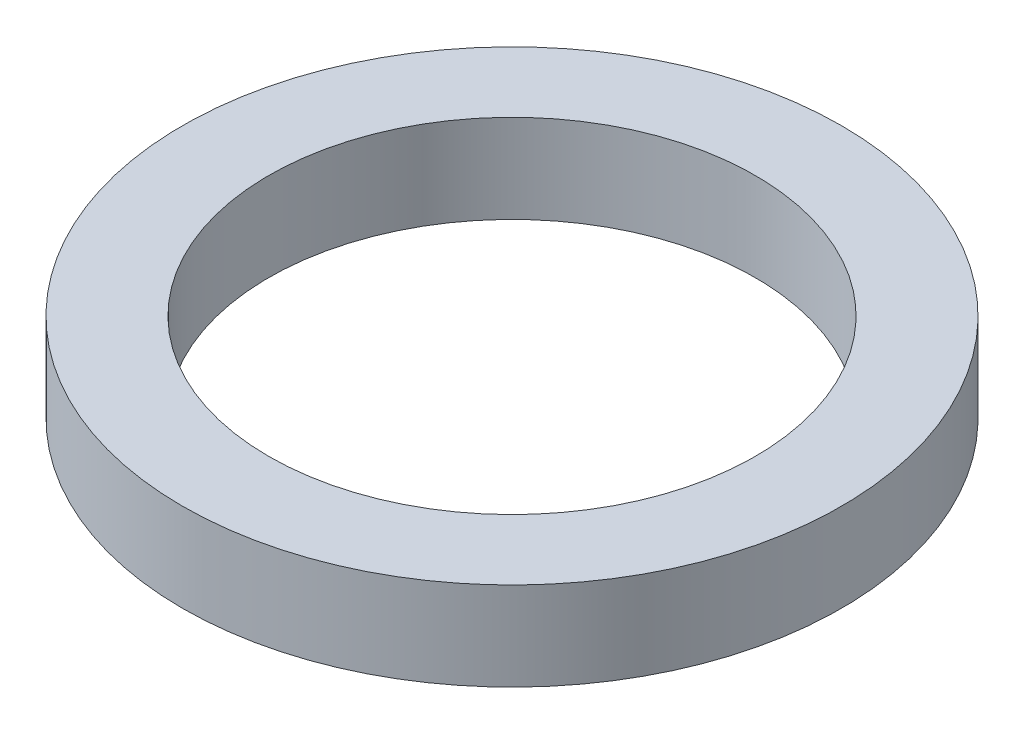
ISO-10303-21;
HEADER;
FILE_DESCRIPTION(('STEP AP214'),'2;1');
FILE_NAME('part.step','',(''),(''),'','','');
FILE_SCHEMA(('AUTOMOTIVE_DESIGN { 1 0 10303 214 1 1 1 1 }'));
ENDSEC;
DATA;
#1=APPLICATION_CONTEXT('core data for automotive mechanical design processes');
#2=APPLICATION_PROTOCOL_DEFINITION('international standard','automotive_design',2000,#1);
#3=PRODUCT_CONTEXT('',#1,'mechanical');
#4=PRODUCT('Part','Part','',(#3));
#5=PRODUCT_RELATED_PRODUCT_CATEGORY('part','',(#4));
#6=PRODUCT_DEFINITION_FORMATION('','',#4);
#7=PRODUCT_DEFINITION_CONTEXT('part definition',#1,'design');
#8=PRODUCT_DEFINITION('design','',#6,#7);
#9=PRODUCT_DEFINITION_SHAPE('','',#8);
#10=(LENGTH_UNIT() NAMED_UNIT(*) SI_UNIT(.MILLI.,.METRE.));
#11=(NAMED_UNIT(*) PLANE_ANGLE_UNIT() SI_UNIT($,.RADIAN.));
#12=(NAMED_UNIT(*) SI_UNIT($,.STERADIAN.) SOLID_ANGLE_UNIT());
#13=UNCERTAINTY_MEASURE_WITH_UNIT(LENGTH_MEASURE(1.E-05),#10,'distance_accuracy_value','');
#14=(GEOMETRIC_REPRESENTATION_CONTEXT(3) GLOBAL_UNCERTAINTY_ASSIGNED_CONTEXT((#13)) GLOBAL_UNIT_ASSIGNED_CONTEXT((#10,
#11,#12)) REPRESENTATION_CONTEXT('',''));
#15=CARTESIAN_POINT('',(0.,0.,0.));
#16=DIRECTION('',(0.,0.,1.));
#17=DIRECTION('',(1.,0.,0.));
#18=AXIS2_PLACEMENT_3D('',#15,#16,#17);
#19=CARTESIAN_POINT('',(0.,2.,0.));
#20=DIRECTION('',(0.,1.,0.));
#21=DIRECTION('',(0.,0.,1.));
#22=AXIS2_PLACEMENT_3D('',#19,#20,#21);
#23=PLANE('',#22);
#24=CARTESIAN_POINT('',(0.,2.,0.));
#25=DIRECTION('',(0.,1.,0.));
#26=DIRECTION('',(0.,0.,1.));
#27=AXIS2_PLACEMENT_3D('',#24,#25,#26);
#28=CIRCLE('',#27,7.45);
#29=CARTESIAN_POINT('',(0.,2.,7.45));
#30=VERTEX_POINT('',#29);
#31=EDGE_CURVE('E10',#30,#30,#28,.T.);
#32=ORIENTED_EDGE('',*,*,#31,.T.);
#33=EDGE_LOOP('',(#32));
#34=FACE_BOUND('',#33,.T.);
#35=CARTESIAN_POINT('',(0.,2.,0.));
#36=DIRECTION('',(0.,1.,0.));
#37=DIRECTION('',(0.,0.,1.));
#38=AXIS2_PLACEMENT_3D('',#35,#36,#37);
#39=CIRCLE('',#38,5.5);
#40=CARTESIAN_POINT('',(0.,2.,5.5));
#41=VERTEX_POINT('',#40);
#42=EDGE_CURVE('E54',#41,#41,#39,.T.);
#43=ORIENTED_EDGE('',*,*,#42,.F.);
#44=EDGE_LOOP('',(#43));
#45=FACE_BOUND('',#44,.T.);
#46=ADVANCED_FACE('F41',(#34,#45),#23,.T.);
#47=CARTESIAN_POINT('',(0.,0.,0.));
#48=DIRECTION('',(0.,1.,0.));
#49=DIRECTION('',(0.,0.,1.));
#50=AXIS2_PLACEMENT_3D('',#47,#48,#49);
#51=PLANE('',#50);
#52=CARTESIAN_POINT('',(0.,0.,0.));
#53=DIRECTION('',(0.,1.,0.));
#54=DIRECTION('',(0.,0.,1.));
#55=AXIS2_PLACEMENT_3D('',#52,#53,#54);
#56=CIRCLE('',#55,7.45);
#57=CARTESIAN_POINT('',(0.,0.,7.45));
#58=VERTEX_POINT('',#57);
#59=EDGE_CURVE('E45',#58,#58,#56,.T.);
#60=ORIENTED_EDGE('',*,*,#59,.F.);
#61=EDGE_LOOP('',(#60));
#62=FACE_BOUND('',#61,.T.);
#63=CARTESIAN_POINT('',(0.,0.,0.));
#64=DIRECTION('',(0.,1.,0.));
#65=DIRECTION('',(0.,0.,1.));
#66=AXIS2_PLACEMENT_3D('',#63,#64,#65);
#67=CIRCLE('',#66,5.5);
#68=CARTESIAN_POINT('',(0.,0.,5.5));
#69=VERTEX_POINT('',#68);
#70=EDGE_CURVE('E56',#69,#69,#67,.T.);
#71=ORIENTED_EDGE('',*,*,#70,.T.);
#72=EDGE_LOOP('',(#71));
#73=FACE_BOUND('',#72,.T.);
#74=ADVANCED_FACE('F68',(#62,#73),#51,.F.);
#75=CARTESIAN_POINT('',(0.,2.,0.));
#76=DIRECTION('',(0.,-1.,0.));
#77=DIRECTION('',(0.,0.,-1.));
#78=AXIS2_PLACEMENT_3D('',#75,#76,#77);
#79=CYLINDRICAL_SURFACE('',#78,7.45);
#80=ORIENTED_EDGE('',*,*,#31,.F.);
#81=EDGE_LOOP('',(#80));
#82=FACE_BOUND('',#81,.T.);
#83=ORIENTED_EDGE('',*,*,#59,.T.);
#84=EDGE_LOOP('',(#83));
#85=FACE_BOUND('',#84,.T.);
#86=ADVANCED_FACE('F43',(#82,#85),#79,.T.);
#87=CARTESIAN_POINT('',(0.,2.,0.));
#88=DIRECTION('',(0.,-1.,0.));
#89=DIRECTION('',(0.,0.,-1.));
#90=AXIS2_PLACEMENT_3D('',#87,#88,#89);
#91=CYLINDRICAL_SURFACE('',#90,5.5);
#92=ORIENTED_EDGE('',*,*,#42,.T.);
#93=EDGE_LOOP('',(#92));
#94=FACE_BOUND('',#93,.T.);
#95=ORIENTED_EDGE('',*,*,#70,.F.);
#96=EDGE_LOOP('',(#95));
#97=FACE_BOUND('',#96,.T.);
#98=ADVANCED_FACE('F64',(#94,#97),#91,.F.);
#99=CLOSED_SHELL('',(#46,#74,#86,#98));
#100=MANIFOLD_SOLID_BREP('B2',#99);
#101=ADVANCED_BREP_SHAPE_REPRESENTATION('',(#18,#100),#14);
#102=SHAPE_DEFINITION_REPRESENTATION(#9,#101);
ENDSEC;
END-ISO-10303-21;
